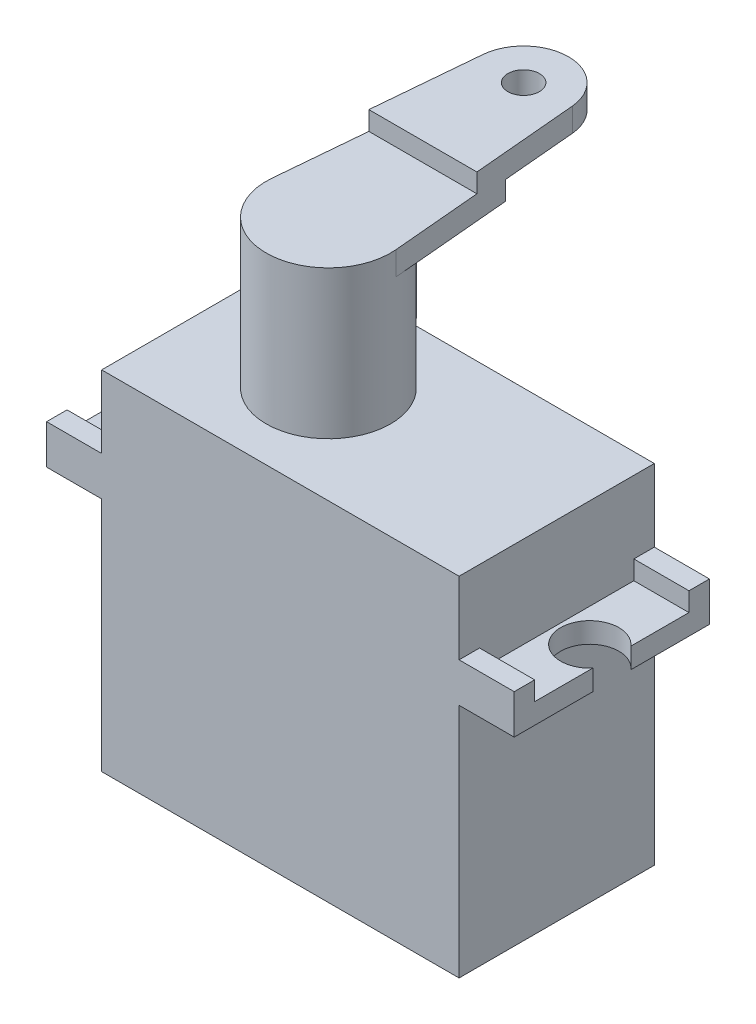
ISO-10303-21;
HEADER;
FILE_DESCRIPTION(('STEP AP214'),'2;1');
FILE_NAME('part.step','',(''),(''),'','','');
FILE_SCHEMA(('AUTOMOTIVE_DESIGN { 1 0 10303 214 1 1 1 1 }'));
ENDSEC;
DATA;
#1=APPLICATION_CONTEXT('core data for automotive mechanical design processes');
#2=APPLICATION_PROTOCOL_DEFINITION('international standard','automotive_design',2000,#1);
#3=PRODUCT_CONTEXT('',#1,'mechanical');
#4=PRODUCT('Part','Part','',(#3));
#5=PRODUCT_RELATED_PRODUCT_CATEGORY('part','',(#4));
#6=PRODUCT_DEFINITION_FORMATION('','',#4);
#7=PRODUCT_DEFINITION_CONTEXT('part definition',#1,'design');
#8=PRODUCT_DEFINITION('design','',#6,#7);
#9=PRODUCT_DEFINITION_SHAPE('','',#8);
#10=(LENGTH_UNIT() NAMED_UNIT(*) SI_UNIT(.MILLI.,.METRE.));
#11=(NAMED_UNIT(*) PLANE_ANGLE_UNIT() SI_UNIT($,.RADIAN.));
#12=(NAMED_UNIT(*) SI_UNIT($,.STERADIAN.) SOLID_ANGLE_UNIT());
#13=UNCERTAINTY_MEASURE_WITH_UNIT(LENGTH_MEASURE(1.E-05),#10,'distance_accuracy_value','');
#14=(GEOMETRIC_REPRESENTATION_CONTEXT(3) GLOBAL_UNCERTAINTY_ASSIGNED_CONTEXT((#13)) GLOBAL_UNIT_ASSIGNED_CONTEXT((#10,
#11,#12)) REPRESENTATION_CONTEXT('',''));
#15=CARTESIAN_POINT('',(0.,0.,0.));
#16=DIRECTION('',(0.,0.,1.));
#17=DIRECTION('',(1.,0.,0.));
#18=AXIS2_PLACEMENT_3D('',#15,#16,#17);
#19=CARTESIAN_POINT('',(-3.15,16.45,-6.2));
#20=DIRECTION('',(0.,1.,0.));
#21=DIRECTION('',(0.,0.,1.));
#22=AXIS2_PLACEMENT_3D('',#19,#20,#21);
#23=PLANE('',#22);
#24=CARTESIAN_POINT('',(-3.15,16.45,-6.2));
#25=DIRECTION('',(0.,1.,0.));
#26=DIRECTION('',(0.,0.,1.));
#27=AXIS2_PLACEMENT_3D('',#24,#25,#26);
#28=CIRCLE('',#27,1.);
#29=CARTESIAN_POINT('',(-3.15,16.45,-5.2));
#30=VERTEX_POINT('',#29);
#31=EDGE_CURVE('E589',#30,#30,#28,.T.);
#32=ORIENTED_EDGE('',*,*,#31,.F.);
#33=EDGE_LOOP('',(#32));
#34=FACE_BOUND('',#33,.T.);
#35=DIRECTION('',(-0.088709677419355,0.,0.99605752501156));
#36=VECTOR('',#35,1.);
#37=CARTESIAN_POINT('',(-5.98876394628295,16.45,-6.45282258064516));
#38=LINE('',#37,#36);
#39=CARTESIAN_POINT('',(-5.98876394628295,16.45,-6.45282258064516));
#40=VERTEX_POINT('',#39);
#41=CARTESIAN_POINT('',(-6.58126963017945,16.45,0.199999999999999));
#42=VERTEX_POINT('',#41);
#43=EDGE_CURVE('E274',#40,#42,#38,.T.);
#44=ORIENTED_EDGE('',*,*,#43,.T.);
#45=DIRECTION('',(1.,0.,0.));
#46=VECTOR('',#45,1.);
#47=CARTESIAN_POINT('',(-14.85,16.45,0.199999999999999));
#48=LINE('',#47,#46);
#49=CARTESIAN_POINT('',(0.281269630179444,16.45,0.199999999999999));
#50=VERTEX_POINT('',#49);
#51=EDGE_CURVE('E254',#42,#50,#48,.T.);
#52=ORIENTED_EDGE('',*,*,#51,.T.);
#53=DIRECTION('',(-0.0887096774193549,0.,-0.99605752501156));
#54=VECTOR('',#53,1.);
#55=CARTESIAN_POINT('',(0.784427223795657,16.45,5.84959677419355));
#56=LINE('',#55,#54);
#57=CARTESIAN_POINT('',(-0.311236053717059,16.45,-6.45282258064516));
#58=VERTEX_POINT('',#57);
#59=EDGE_CURVE('E282',#50,#58,#56,.T.);
#60=ORIENTED_EDGE('',*,*,#59,.T.);
#61=CARTESIAN_POINT('',(-3.15,16.45,-6.2));
#62=DIRECTION('',(0.,1.,0.));
#63=DIRECTION('',(0.,0.,1.));
#64=AXIS2_PLACEMENT_3D('',#61,#62,#63);
#65=CIRCLE('',#64,2.85);
#66=EDGE_CURVE('E281',#58,#40,#65,.T.);
#67=ORIENTED_EDGE('',*,*,#66,.T.);
#68=EDGE_LOOP('',(#44,#52,#60,#67));
#69=FACE_BOUND('',#68,.T.);
#70=ADVANCED_FACE('F44',(#34,#69),#23,.T.);
#71=CARTESIAN_POINT('',(-14.85,1.25,12.4));
#72=DIRECTION('',(1.,0.,0.));
#73=DIRECTION('',(0.,0.,-1.));
#74=AXIS2_PLACEMENT_3D('',#71,#72,#73);
#75=PLANE('',#74);
#76=DIRECTION('',(0.,1.,0.));
#77=VECTOR('',#76,1.);
#78=CARTESIAN_POINT('',(-14.85,-1.75,7.40933866224478));
#79=LINE('',#78,#77);
#80=CARTESIAN_POINT('',(-14.85,-1.25,7.40933866224478));
#81=VERTEX_POINT('',#80);
#82=CARTESIAN_POINT('',(-14.85,0.0500000000000001,7.40933866224478));
#83=VERTEX_POINT('',#82);
#84=EDGE_CURVE('E317',#81,#83,#79,.T.);
#85=ORIENTED_EDGE('',*,*,#84,.F.);
#86=DIRECTION('',(0.,0.,-1.));
#87=VECTOR('',#86,1.);
#88=CARTESIAN_POINT('',(-14.85,-1.25,12.4));
#89=LINE('',#88,#87);
#90=CARTESIAN_POINT('',(-14.85,-1.25,12.4));
#91=VERTEX_POINT('',#90);
#92=EDGE_CURVE('E541',#91,#81,#89,.T.);
#93=ORIENTED_EDGE('',*,*,#92,.F.);
#94=DIRECTION('',(0.,-1.,0.));
#95=VECTOR('',#94,1.);
#96=CARTESIAN_POINT('',(-14.85,1.25,12.4));
#97=LINE('',#96,#95);
#98=CARTESIAN_POINT('',(-14.85,1.25,12.4));
#99=VERTEX_POINT('',#98);
#100=EDGE_CURVE('E431',#99,#91,#97,.T.);
#101=ORIENTED_EDGE('',*,*,#100,.F.);
#102=DIRECTION('',(0.,0.,-1.));
#103=VECTOR('',#102,1.);
#104=CARTESIAN_POINT('',(-14.85,1.25,12.4));
#105=LINE('',#104,#103);
#106=CARTESIAN_POINT('',(-14.85,1.25,11.1));
#107=VERTEX_POINT('',#106);
#108=EDGE_CURVE('E546',#99,#107,#105,.T.);
#109=ORIENTED_EDGE('',*,*,#108,.T.);
#110=DIRECTION('',(0.,1.,0.));
#111=VECTOR('',#110,1.);
#112=CARTESIAN_POINT('',(-14.85,0.0500000000000001,11.1));
#113=LINE('',#112,#111);
#114=CARTESIAN_POINT('',(-14.85,0.0500000000000001,11.1));
#115=VERTEX_POINT('',#114);
#116=EDGE_CURVE('E367',#115,#107,#113,.T.);
#117=ORIENTED_EDGE('',*,*,#116,.F.);
#118=DIRECTION('',(0.,0.,-1.));
#119=VECTOR('',#118,1.);
#120=CARTESIAN_POINT('',(-14.85,0.0500000000000001,0.));
#121=LINE('',#120,#119);
#122=EDGE_CURVE('E340',#115,#83,#121,.T.);
#123=ORIENTED_EDGE('',*,*,#122,.T.);
#124=EDGE_LOOP('',(#85,#93,#101,#109,#117,#123));
#125=FACE_BOUND('',#124,.T.);
#126=ADVANCED_FACE('F608',(#125),#75,.F.);
#127=CARTESIAN_POINT('',(-14.85,1.25,12.4));
#128=DIRECTION('',(0.,-1.,0.));
#129=DIRECTION('',(1.,0.,0.));
#130=AXIS2_PLACEMENT_3D('',#127,#128,#129);
#131=PLANE('',#130);
#132=DIRECTION('',(0.,0.,-1.));
#133=VECTOR('',#132,1.);
#134=CARTESIAN_POINT('',(-11.35,1.25,12.4));
#135=LINE('',#134,#133);
#136=CARTESIAN_POINT('',(-11.35,1.25,12.4));
#137=VERTEX_POINT('',#136);
#138=CARTESIAN_POINT('',(-11.35,1.25,11.1));
#139=VERTEX_POINT('',#138);
#140=EDGE_CURVE('E323',#137,#139,#135,.T.);
#141=ORIENTED_EDGE('',*,*,#140,.T.);
#142=DIRECTION('',(-1.,0.,0.));
#143=VECTOR('',#142,1.);
#144=CARTESIAN_POINT('',(0.,1.25000000000001,11.1));
#145=LINE('',#144,#143);
#146=EDGE_CURVE('E334',#139,#107,#145,.T.);
#147=ORIENTED_EDGE('',*,*,#146,.T.);
#148=ORIENTED_EDGE('',*,*,#108,.F.);
#149=DIRECTION('',(-1.,0.,0.));
#150=VECTOR('',#149,1.);
#151=CARTESIAN_POINT('',(-14.85,1.25,12.4));
#152=LINE('',#151,#150);
#153=EDGE_CURVE('E430',#137,#99,#152,.T.);
#154=ORIENTED_EDGE('',*,*,#153,.F.);
#155=EDGE_LOOP('',(#141,#147,#148,#154));
#156=FACE_BOUND('',#155,.T.);
#157=ADVANCED_FACE('F620',(#156),#131,.F.);
#158=CARTESIAN_POINT('',(14.85,1.25,12.4));
#159=DIRECTION('',(-1.,0.,0.));
#160=DIRECTION('',(0.,0.,1.));
#161=AXIS2_PLACEMENT_3D('',#158,#159,#160);
#162=PLANE('',#161);
#163=DIRECTION('',(0.,1.,0.));
#164=VECTOR('',#163,1.);
#165=CARTESIAN_POINT('',(14.85,-1.75,4.99066133775522));
#166=LINE('',#165,#164);
#167=CARTESIAN_POINT('',(14.85,-1.25,4.99066133775522));
#168=VERTEX_POINT('',#167);
#169=CARTESIAN_POINT('',(14.85,0.0500000000000001,4.99066133775522));
#170=VERTEX_POINT('',#169);
#171=EDGE_CURVE('E361',#168,#170,#166,.T.);
#172=ORIENTED_EDGE('',*,*,#171,.F.);
#173=DIRECTION('',(0.,0.,-1.));
#174=VECTOR('',#173,1.);
#175=CARTESIAN_POINT('',(14.85,-1.25,12.4));
#176=LINE('',#175,#174);
#177=CARTESIAN_POINT('',(14.85,-1.25,0.));
#178=VERTEX_POINT('',#177);
#179=EDGE_CURVE('E518',#168,#178,#176,.T.);
#180=ORIENTED_EDGE('',*,*,#179,.T.);
#181=DIRECTION('',(0.,1.,0.));
#182=VECTOR('',#181,1.);
#183=CARTESIAN_POINT('',(14.85,1.25,0.));
#184=LINE('',#183,#182);
#185=CARTESIAN_POINT('',(14.85,1.25,0.));
#186=VERTEX_POINT('',#185);
#187=EDGE_CURVE('E487',#178,#186,#184,.T.);
#188=ORIENTED_EDGE('',*,*,#187,.T.);
#189=DIRECTION('',(0.,0.,-1.));
#190=VECTOR('',#189,1.);
#191=CARTESIAN_POINT('',(14.85,1.25,12.4));
#192=LINE('',#191,#190);
#193=CARTESIAN_POINT('',(14.85,1.25,1.3));
#194=VERTEX_POINT('',#193);
#195=EDGE_CURVE('E514',#194,#186,#192,.T.);
#196=ORIENTED_EDGE('',*,*,#195,.F.);
#197=DIRECTION('',(0.,1.,0.));
#198=VECTOR('',#197,1.);
#199=CARTESIAN_POINT('',(14.85,0.0500000000000001,1.3));
#200=LINE('',#199,#198);
#201=CARTESIAN_POINT('',(14.85,0.0500000000000001,1.3));
#202=VERTEX_POINT('',#201);
#203=EDGE_CURVE('E419',#202,#194,#200,.T.);
#204=ORIENTED_EDGE('',*,*,#203,.F.);
#205=DIRECTION('',(0.,0.,-1.));
#206=VECTOR('',#205,1.);
#207=CARTESIAN_POINT('',(14.85,0.0500000000000001,0.));
#208=LINE('',#207,#206);
#209=EDGE_CURVE('E390',#170,#202,#208,.T.);
#210=ORIENTED_EDGE('',*,*,#209,.F.);
#211=EDGE_LOOP('',(#172,#180,#188,#196,#204,#210));
#212=FACE_BOUND('',#211,.T.);
#213=ADVANCED_FACE('F700',(#212),#162,.F.);
#214=CARTESIAN_POINT('',(11.35,1.25,12.4));
#215=DIRECTION('',(0.,-1.,0.));
#216=DIRECTION('',(1.,0.,0.));
#217=AXIS2_PLACEMENT_3D('',#214,#215,#216);
#218=PLANE('',#217);
#219=DIRECTION('',(1.,0.,0.));
#220=VECTOR('',#219,1.);
#221=CARTESIAN_POINT('',(0.,1.25000000000001,11.1));
#222=LINE('',#221,#220);
#223=CARTESIAN_POINT('',(11.35,1.25,11.1));
#224=VERTEX_POINT('',#223);
#225=CARTESIAN_POINT('',(14.85,1.25,11.1));
#226=VERTEX_POINT('',#225);
#227=EDGE_CURVE('E389',#224,#226,#222,.T.);
#228=ORIENTED_EDGE('',*,*,#227,.F.);
#229=DIRECTION('',(0.,0.,-1.));
#230=VECTOR('',#229,1.);
#231=CARTESIAN_POINT('',(11.35,1.25,12.4));
#232=LINE('',#231,#230);
#233=CARTESIAN_POINT('',(11.35,1.25,12.4));
#234=VERTEX_POINT('',#233);
#235=EDGE_CURVE('E509',#234,#224,#232,.T.);
#236=ORIENTED_EDGE('',*,*,#235,.F.);
#237=DIRECTION('',(-1.,0.,0.));
#238=VECTOR('',#237,1.);
#239=CARTESIAN_POINT('',(11.35,1.25,12.4));
#240=LINE('',#239,#238);
#241=CARTESIAN_POINT('',(14.85,1.25,12.4));
#242=VERTEX_POINT('',#241);
#243=EDGE_CURVE('E455',#242,#234,#240,.T.);
#244=ORIENTED_EDGE('',*,*,#243,.F.);
#245=EDGE_CURVE('E513',#242,#226,#192,.T.);
#246=ORIENTED_EDGE('',*,*,#245,.T.);
#247=EDGE_LOOP('',(#228,#236,#244,#246));
#248=FACE_BOUND('',#247,.T.);
#249=ADVANCED_FACE('F692',(#248),#218,.F.);
#250=CARTESIAN_POINT('',(-11.35,5.85,12.4));
#251=DIRECTION('',(1.,0.,0.));
#252=DIRECTION('',(0.,1.,0.));
#253=AXIS2_PLACEMENT_3D('',#250,#251,#252);
#254=PLANE('',#253);
#255=DIRECTION('',(0.,-1.,0.));
#256=VECTOR('',#255,1.);
#257=CARTESIAN_POINT('',(-11.35,5.85,0.));
#258=LINE('',#257,#256);
#259=CARTESIAN_POINT('',(-11.35,5.85,0.));
#260=VERTEX_POINT('',#259);
#261=CARTESIAN_POINT('',(-11.35,1.25,0.));
#262=VERTEX_POINT('',#261);
#263=EDGE_CURVE('E411',#260,#262,#258,.T.);
#264=ORIENTED_EDGE('',*,*,#263,.T.);
#265=CARTESIAN_POINT('',(-11.35,1.25,1.3));
#266=VERTEX_POINT('',#265);
#267=EDGE_CURVE('E549',#266,#262,#135,.T.);
#268=ORIENTED_EDGE('',*,*,#267,.F.);
#269=DIRECTION('',(0.,1.,0.));
#270=VECTOR('',#269,1.);
#271=CARTESIAN_POINT('',(-11.35,0.0500000000000021,1.3));
#272=LINE('',#271,#270);
#273=CARTESIAN_POINT('',(-11.35,0.0500000000000021,1.3));
#274=VERTEX_POINT('',#273);
#275=EDGE_CURVE('E365',#274,#266,#272,.T.);
#276=ORIENTED_EDGE('',*,*,#275,.F.);
#277=DIRECTION('',(0.,0.,1.));
#278=VECTOR('',#277,1.);
#279=CARTESIAN_POINT('',(-11.35,0.0500000000000021,0.));
#280=LINE('',#279,#278);
#281=CARTESIAN_POINT('',(-11.35,0.0500000000000021,11.1));
#282=VERTEX_POINT('',#281);
#283=EDGE_CURVE('E350',#274,#282,#280,.T.);
#284=ORIENTED_EDGE('',*,*,#283,.T.);
#285=DIRECTION('',(0.,1.,0.));
#286=VECTOR('',#285,1.);
#287=CARTESIAN_POINT('',(-11.35,0.0500000000000021,11.1));
#288=LINE('',#287,#286);
#289=EDGE_CURVE('E370',#282,#139,#288,.T.);
#290=ORIENTED_EDGE('',*,*,#289,.T.);
#291=ORIENTED_EDGE('',*,*,#140,.F.);
#292=DIRECTION('',(0.,-1.,0.));
#293=VECTOR('',#292,1.);
#294=CARTESIAN_POINT('',(-11.35,5.85,12.4));
#295=LINE('',#294,#293);
#296=CARTESIAN_POINT('',(-11.35,5.85,12.4));
#297=VERTEX_POINT('',#296);
#298=EDGE_CURVE('E421',#297,#137,#295,.T.);
#299=ORIENTED_EDGE('',*,*,#298,.F.);
#300=DIRECTION('',(0.,0.,-1.));
#301=VECTOR('',#300,1.);
#302=CARTESIAN_POINT('',(-11.35,5.85,12.4));
#303=LINE('',#302,#301);
#304=EDGE_CURVE('E464',#297,#260,#303,.T.);
#305=ORIENTED_EDGE('',*,*,#304,.T.);
#306=EDGE_LOOP('',(#264,#268,#276,#284,#290,#291,#299,#305));
#307=FACE_BOUND('',#306,.T.);
#308=ADVANCED_FACE('F50',(#307),#254,.F.);
#309=DIRECTION('',(-1.,0.,0.));
#310=VECTOR('',#309,1.);
#311=CARTESIAN_POINT('',(0.,1.25000000000001,1.3));
#312=LINE('',#311,#310);
#313=CARTESIAN_POINT('',(-14.85,1.25,1.3));
#314=VERTEX_POINT('',#313);
#315=EDGE_CURVE('E338',#266,#314,#312,.T.);
#316=ORIENTED_EDGE('',*,*,#315,.F.);
#317=ORIENTED_EDGE('',*,*,#267,.T.);
#318=DIRECTION('',(-1.,0.,0.));
#319=VECTOR('',#318,1.);
#320=CARTESIAN_POINT('',(-14.85,1.25,0.));
#321=LINE('',#320,#319);
#322=CARTESIAN_POINT('',(-14.85,1.25,0.));
#323=VERTEX_POINT('',#322);
#324=EDGE_CURVE('E462',#262,#323,#321,.T.);
#325=ORIENTED_EDGE('',*,*,#324,.T.);
#326=EDGE_CURVE('E544',#314,#323,#105,.T.);
#327=ORIENTED_EDGE('',*,*,#326,.F.);
#328=EDGE_LOOP('',(#316,#317,#325,#327));
#329=FACE_BOUND('',#328,.T.);
#330=ADVANCED_FACE('F720',(#329),#131,.F.);
#331=CARTESIAN_POINT('',(-14.85,-1.25,4.99066133775522));
#332=VERTEX_POINT('',#331);
#333=CARTESIAN_POINT('',(-14.85,-1.25,0.));
#334=VERTEX_POINT('',#333);
#335=EDGE_CURVE('E539',#332,#334,#89,.T.);
#336=ORIENTED_EDGE('',*,*,#335,.F.);
#337=DIRECTION('',(0.,1.,0.));
#338=VECTOR('',#337,1.);
#339=CARTESIAN_POINT('',(-14.85,-1.75,4.99066133775522));
#340=LINE('',#339,#338);
#341=CARTESIAN_POINT('',(-14.85,0.0500000000000001,4.99066133775522));
#342=VERTEX_POINT('',#341);
#343=EDGE_CURVE('E322',#332,#342,#340,.T.);
#344=ORIENTED_EDGE('',*,*,#343,.T.);
#345=CARTESIAN_POINT('',(-14.85,0.0500000000000001,1.3));
#346=VERTEX_POINT('',#345);
#347=EDGE_CURVE('E342',#342,#346,#121,.T.);
#348=ORIENTED_EDGE('',*,*,#347,.T.);
#349=DIRECTION('',(0.,1.,0.));
#350=VECTOR('',#349,1.);
#351=CARTESIAN_POINT('',(-14.85,0.0500000000000001,1.3));
#352=LINE('',#351,#350);
#353=EDGE_CURVE('E357',#346,#314,#352,.T.);
#354=ORIENTED_EDGE('',*,*,#353,.T.);
#355=ORIENTED_EDGE('',*,*,#326,.T.);
#356=DIRECTION('',(0.,-1.,0.));
#357=VECTOR('',#356,1.);
#358=CARTESIAN_POINT('',(-14.85,1.25,0.));
#359=LINE('',#358,#357);
#360=EDGE_CURVE('E467',#323,#334,#359,.T.);
#361=ORIENTED_EDGE('',*,*,#360,.T.);
#362=EDGE_LOOP('',(#336,#344,#348,#354,#355,#361));
#363=FACE_BOUND('',#362,.T.);
#364=ADVANCED_FACE('F619',(#363),#75,.F.);
#365=CARTESIAN_POINT('',(-14.85,-1.25,12.4));
#366=DIRECTION('',(0.,1.,0.));
#367=DIRECTION('',(-1.,0.,0.));
#368=AXIS2_PLACEMENT_3D('',#365,#366,#367);
#369=PLANE('',#368);
#370=CARTESIAN_POINT('',(-13.45,-1.25,6.2));
#371=DIRECTION('',(0.,1.,0.));
#372=DIRECTION('',(-1.,0.,0.));
#373=AXIS2_PLACEMENT_3D('',#370,#371,#372);
#374=CIRCLE('',#373,1.85);
#375=EDGE_CURVE('E327',#332,#81,#374,.F.);
#376=ORIENTED_EDGE('',*,*,#375,.F.);
#377=ORIENTED_EDGE('',*,*,#335,.T.);
#378=DIRECTION('',(1.,0.,0.));
#379=VECTOR('',#378,1.);
#380=CARTESIAN_POINT('',(-14.85,-1.25,0.));
#381=LINE('',#380,#379);
#382=CARTESIAN_POINT('',(-11.35,-1.25,0.));
#383=VERTEX_POINT('',#382);
#384=EDGE_CURVE('E471',#334,#383,#381,.T.);
#385=ORIENTED_EDGE('',*,*,#384,.T.);
#386=DIRECTION('',(0.,0.,-1.));
#387=VECTOR('',#386,1.);
#388=CARTESIAN_POINT('',(-11.35,-1.25,12.4));
#389=LINE('',#388,#387);
#390=CARTESIAN_POINT('',(-11.35,-1.25,12.4));
#391=VERTEX_POINT('',#390);
#392=EDGE_CURVE('E536',#391,#383,#389,.T.);
#393=ORIENTED_EDGE('',*,*,#392,.F.);
#394=DIRECTION('',(1.,0.,0.));
#395=VECTOR('',#394,1.);
#396=CARTESIAN_POINT('',(-14.85,-1.25,12.4));
#397=LINE('',#396,#395);
#398=EDGE_CURVE('E432',#91,#391,#397,.T.);
#399=ORIENTED_EDGE('',*,*,#398,.F.);
#400=ORIENTED_EDGE('',*,*,#92,.T.);
#401=EDGE_LOOP('',(#376,#377,#385,#393,#399,#400));
#402=FACE_BOUND('',#401,.T.);
#403=ADVANCED_FACE('F715',(#402),#369,.F.);
#404=CARTESIAN_POINT('',(-11.35,-1.25,12.4));
#405=DIRECTION('',(1.,0.,0.));
#406=DIRECTION('',(0.,1.,0.));
#407=AXIS2_PLACEMENT_3D('',#404,#405,#406);
#408=PLANE('',#407);
#409=DIRECTION('',(0.,-1.,0.));
#410=VECTOR('',#409,1.);
#411=CARTESIAN_POINT('',(-11.35,-1.25,0.));
#412=LINE('',#411,#410);
#413=CARTESIAN_POINT('',(-11.35,-16.25,0.));
#414=VERTEX_POINT('',#413);
#415=EDGE_CURVE('E478',#383,#414,#412,.T.);
#416=ORIENTED_EDGE('',*,*,#415,.T.);
#417=DIRECTION('',(0.,0.,-1.));
#418=VECTOR('',#417,1.);
#419=CARTESIAN_POINT('',(-11.35,-16.25,12.4));
#420=LINE('',#419,#418);
#421=CARTESIAN_POINT('',(-11.35,-16.25,12.4));
#422=VERTEX_POINT('',#421);
#423=EDGE_CURVE('E535',#422,#414,#420,.T.);
#424=ORIENTED_EDGE('',*,*,#423,.F.);
#425=DIRECTION('',(0.,-1.,0.));
#426=VECTOR('',#425,1.);
#427=CARTESIAN_POINT('',(-11.35,-1.25,12.4));
#428=LINE('',#427,#426);
#429=EDGE_CURVE('E440',#391,#422,#428,.T.);
#430=ORIENTED_EDGE('',*,*,#429,.F.);
#431=ORIENTED_EDGE('',*,*,#392,.T.);
#432=EDGE_LOOP('',(#416,#424,#430,#431));
#433=FACE_BOUND('',#432,.T.);
#434=ADVANCED_FACE('F708',(#433),#408,.F.);
#435=CARTESIAN_POINT('',(-11.35,-16.25,12.4));
#436=DIRECTION('',(0.,1.,0.));
#437=DIRECTION('',(0.,0.,1.));
#438=AXIS2_PLACEMENT_3D('',#435,#436,#437);
#439=PLANE('',#438);
#440=DIRECTION('',(1.,0.,0.));
#441=VECTOR('',#440,1.);
#442=CARTESIAN_POINT('',(-11.35,-16.25,0.));
#443=LINE('',#442,#441);
#444=CARTESIAN_POINT('',(11.35,-16.25,0.));
#445=VERTEX_POINT('',#444);
#446=EDGE_CURVE('E479',#414,#445,#443,.T.);
#447=ORIENTED_EDGE('',*,*,#446,.T.);
#448=DIRECTION('',(0.,0.,-1.));
#449=VECTOR('',#448,1.);
#450=CARTESIAN_POINT('',(11.35,-16.25,12.4));
#451=LINE('',#450,#449);
#452=CARTESIAN_POINT('',(11.35,-16.25,12.4));
#453=VERTEX_POINT('',#452);
#454=EDGE_CURVE('E526',#453,#445,#451,.T.);
#455=ORIENTED_EDGE('',*,*,#454,.F.);
#456=DIRECTION('',(1.,0.,0.));
#457=VECTOR('',#456,1.);
#458=CARTESIAN_POINT('',(-11.35,-16.25,12.4));
#459=LINE('',#458,#457);
#460=EDGE_CURVE('E439',#422,#453,#459,.T.);
#461=ORIENTED_EDGE('',*,*,#460,.F.);
#462=ORIENTED_EDGE('',*,*,#423,.T.);
#463=EDGE_LOOP('',(#447,#455,#461,#462));
#464=FACE_BOUND('',#463,.T.);
#465=ADVANCED_FACE('F702',(#464),#439,.F.);
#466=CARTESIAN_POINT('',(11.35,-1.25,12.4));
#467=DIRECTION('',(-1.,0.,0.));
#468=DIRECTION('',(0.,-1.,0.));
#469=AXIS2_PLACEMENT_3D('',#466,#467,#468);
#470=PLANE('',#469);
#471=DIRECTION('',(0.,1.,0.));
#472=VECTOR('',#471,1.);
#473=CARTESIAN_POINT('',(11.35,-1.25,0.));
#474=LINE('',#473,#472);
#475=CARTESIAN_POINT('',(11.35,-1.25,0.));
#476=VERTEX_POINT('',#475);
#477=EDGE_CURVE('E485',#445,#476,#474,.T.);
#478=ORIENTED_EDGE('',*,*,#477,.T.);
#479=DIRECTION('',(0.,0.,-1.));
#480=VECTOR('',#479,1.);
#481=CARTESIAN_POINT('',(11.35,-1.25,12.4));
#482=LINE('',#481,#480);
#483=CARTESIAN_POINT('',(11.35,-1.25,12.4));
#484=VERTEX_POINT('',#483);
#485=EDGE_CURVE('E522',#484,#476,#482,.T.);
#486=ORIENTED_EDGE('',*,*,#485,.F.);
#487=DIRECTION('',(0.,1.,0.));
#488=VECTOR('',#487,1.);
#489=CARTESIAN_POINT('',(11.35,-1.25,12.4));
#490=LINE('',#489,#488);
#491=EDGE_CURVE('E444',#453,#484,#490,.T.);
#492=ORIENTED_EDGE('',*,*,#491,.F.);
#493=ORIENTED_EDGE('',*,*,#454,.T.);
#494=EDGE_LOOP('',(#478,#486,#492,#493));
#495=FACE_BOUND('',#494,.T.);
#496=ADVANCED_FACE('F697',(#495),#470,.F.);
#497=CARTESIAN_POINT('',(11.35,-1.25,12.4));
#498=DIRECTION('',(0.,1.,0.));
#499=DIRECTION('',(-1.,0.,0.));
#500=AXIS2_PLACEMENT_3D('',#497,#498,#499);
#501=PLANE('',#500);
#502=ORIENTED_EDGE('',*,*,#179,.F.);
#503=CARTESIAN_POINT('',(13.45,-1.25,6.2));
#504=DIRECTION('',(0.,1.,0.));
#505=DIRECTION('',(-1.,0.,0.));
#506=AXIS2_PLACEMENT_3D('',#503,#504,#505);
#507=CIRCLE('',#506,1.85);
#508=CARTESIAN_POINT('',(14.85,-1.25,7.40933866224478));
#509=VERTEX_POINT('',#508);
#510=EDGE_CURVE('E380',#168,#509,#507,.T.);
#511=ORIENTED_EDGE('',*,*,#510,.T.);
#512=CARTESIAN_POINT('',(14.85,-1.25,12.4));
#513=VERTEX_POINT('',#512);
#514=EDGE_CURVE('E517',#513,#509,#176,.T.);
#515=ORIENTED_EDGE('',*,*,#514,.F.);
#516=DIRECTION('',(1.,0.,0.));
#517=VECTOR('',#516,1.);
#518=CARTESIAN_POINT('',(11.35,-1.25,12.4));
#519=LINE('',#518,#517);
#520=EDGE_CURVE('E449',#484,#513,#519,.T.);
#521=ORIENTED_EDGE('',*,*,#520,.F.);
#522=ORIENTED_EDGE('',*,*,#485,.T.);
#523=DIRECTION('',(1.,0.,0.));
#524=VECTOR('',#523,1.);
#525=CARTESIAN_POINT('',(11.35,-1.25,0.));
#526=LINE('',#525,#524);
#527=EDGE_CURVE('E484',#476,#178,#526,.T.);
#528=ORIENTED_EDGE('',*,*,#527,.T.);
#529=EDGE_LOOP('',(#502,#511,#515,#521,#522,#528));
#530=FACE_BOUND('',#529,.T.);
#531=ADVANCED_FACE('F694',(#530),#501,.F.);
#532=ORIENTED_EDGE('',*,*,#514,.T.);
#533=DIRECTION('',(0.,1.,0.));
#534=VECTOR('',#533,1.);
#535=CARTESIAN_POINT('',(14.85,-1.75,7.40933866224478));
#536=LINE('',#535,#534);
#537=CARTESIAN_POINT('',(14.85,0.0500000000000001,7.40933866224478));
#538=VERTEX_POINT('',#537);
#539=EDGE_CURVE('E373',#509,#538,#536,.T.);
#540=ORIENTED_EDGE('',*,*,#539,.T.);
#541=CARTESIAN_POINT('',(14.85,0.0500000000000001,11.1));
#542=VERTEX_POINT('',#541);
#543=EDGE_CURVE('E395',#542,#538,#208,.T.);
#544=ORIENTED_EDGE('',*,*,#543,.F.);
#545=DIRECTION('',(0.,1.,0.));
#546=VECTOR('',#545,1.);
#547=CARTESIAN_POINT('',(14.85,0.0500000000000001,11.1));
#548=LINE('',#547,#546);
#549=EDGE_CURVE('E408',#542,#226,#548,.T.);
#550=ORIENTED_EDGE('',*,*,#549,.T.);
#551=ORIENTED_EDGE('',*,*,#245,.F.);
#552=DIRECTION('',(0.,1.,0.));
#553=VECTOR('',#552,1.);
#554=CARTESIAN_POINT('',(14.85,1.25,12.4));
#555=LINE('',#554,#553);
#556=EDGE_CURVE('E448',#513,#242,#555,.T.);
#557=ORIENTED_EDGE('',*,*,#556,.F.);
#558=EDGE_LOOP('',(#532,#540,#544,#550,#551,#557));
#559=FACE_BOUND('',#558,.T.);
#560=ADVANCED_FACE('F689',(#559),#162,.F.);
#561=CARTESIAN_POINT('',(11.35,1.25,1.3));
#562=VERTEX_POINT('',#561);
#563=CARTESIAN_POINT('',(11.35,1.25,0.));
#564=VERTEX_POINT('',#563);
#565=EDGE_CURVE('E507',#562,#564,#232,.T.);
#566=ORIENTED_EDGE('',*,*,#565,.F.);
#567=DIRECTION('',(1.,0.,0.));
#568=VECTOR('',#567,1.);
#569=CARTESIAN_POINT('',(0.,1.25000000000001,1.3));
#570=LINE('',#569,#568);
#571=EDGE_CURVE('E382',#562,#194,#570,.T.);
#572=ORIENTED_EDGE('',*,*,#571,.T.);
#573=ORIENTED_EDGE('',*,*,#195,.T.);
#574=DIRECTION('',(-1.,0.,0.));
#575=VECTOR('',#574,1.);
#576=CARTESIAN_POINT('',(11.35,1.25,0.));
#577=LINE('',#576,#575);
#578=EDGE_CURVE('E492',#186,#564,#577,.T.);
#579=ORIENTED_EDGE('',*,*,#578,.T.);
#580=EDGE_LOOP('',(#566,#572,#573,#579));
#581=FACE_BOUND('',#580,.T.);
#582=ADVANCED_FACE('F688',(#581),#218,.F.);
#583=CARTESIAN_POINT('',(11.35,5.85,12.4));
#584=DIRECTION('',(-1.,0.,0.));
#585=DIRECTION('',(0.,-1.,0.));
#586=AXIS2_PLACEMENT_3D('',#583,#584,#585);
#587=PLANE('',#586);
#588=DIRECTION('',(0.,1.,0.));
#589=VECTOR('',#588,1.);
#590=CARTESIAN_POINT('',(11.35,5.85,0.));
#591=LINE('',#590,#589);
#592=CARTESIAN_POINT('',(11.35,5.85,0.));
#593=VERTEX_POINT('',#592);
#594=EDGE_CURVE('E500',#564,#593,#591,.T.);
#595=ORIENTED_EDGE('',*,*,#594,.T.);
#596=DIRECTION('',(0.,0.,-1.));
#597=VECTOR('',#596,1.);
#598=CARTESIAN_POINT('',(11.35,5.85,12.4));
#599=LINE('',#598,#597);
#600=CARTESIAN_POINT('',(11.35,5.85,12.4));
#601=VERTEX_POINT('',#600);
#602=EDGE_CURVE('E502',#601,#593,#599,.T.);
#603=ORIENTED_EDGE('',*,*,#602,.F.);
#604=DIRECTION('',(0.,1.,0.));
#605=VECTOR('',#604,1.);
#606=CARTESIAN_POINT('',(11.35,5.85,12.4));
#607=LINE('',#606,#605);
#608=EDGE_CURVE('E454',#234,#601,#607,.T.);
#609=ORIENTED_EDGE('',*,*,#608,.F.);
#610=ORIENTED_EDGE('',*,*,#235,.T.);
#611=DIRECTION('',(0.,1.,0.));
#612=VECTOR('',#611,1.);
#613=CARTESIAN_POINT('',(11.35,0.0500000000000021,11.1));
#614=LINE('',#613,#612);
#615=CARTESIAN_POINT('',(11.35,0.0500000000000021,11.1));
#616=VERTEX_POINT('',#615);
#617=EDGE_CURVE('E412',#616,#224,#614,.T.);
#618=ORIENTED_EDGE('',*,*,#617,.F.);
#619=DIRECTION('',(0.,0.,1.));
#620=VECTOR('',#619,1.);
#621=CARTESIAN_POINT('',(11.35,0.0500000000000021,0.));
#622=LINE('',#621,#620);
#623=CARTESIAN_POINT('',(11.35,0.0500000000000021,1.3));
#624=VERTEX_POINT('',#623);
#625=EDGE_CURVE('E398',#624,#616,#622,.T.);
#626=ORIENTED_EDGE('',*,*,#625,.F.);
#627=DIRECTION('',(0.,1.,0.));
#628=VECTOR('',#627,1.);
#629=CARTESIAN_POINT('',(11.35,0.0500000000000021,1.3));
#630=LINE('',#629,#628);
#631=EDGE_CURVE('E417',#624,#562,#630,.T.);
#632=ORIENTED_EDGE('',*,*,#631,.T.);
#633=ORIENTED_EDGE('',*,*,#565,.T.);
#634=EDGE_LOOP('',(#595,#603,#609,#610,#618,#626,#632,#633));
#635=FACE_BOUND('',#634,.T.);
#636=ADVANCED_FACE('F681',(#635),#587,.F.);
#637=CARTESIAN_POINT('',(-11.35,5.85,12.4));
#638=DIRECTION('',(0.,-1.,0.));
#639=DIRECTION('',(0.,0.,-1.));
#640=AXIS2_PLACEMENT_3D('',#637,#638,#639);
#641=PLANE('',#640);
#642=CARTESIAN_POINT('',(-3.15,5.85,6.2));
#643=DIRECTION('',(0.,1.,0.));
#644=DIRECTION('',(0.,0.,1.));
#645=AXIS2_PLACEMENT_3D('',#642,#643,#644);
#646=CIRCLE('',#645,3.95);
#647=CARTESIAN_POINT('',(-3.15,5.85,10.15));
#648=VERTEX_POINT('',#647);
#649=EDGE_CURVE('E268',#648,#648,#646,.T.);
#650=ORIENTED_EDGE('',*,*,#649,.F.);
#651=EDGE_LOOP('',(#650));
#652=FACE_BOUND('',#651,.T.);
#653=DIRECTION('',(-1.,0.,0.));
#654=VECTOR('',#653,1.);
#655=CARTESIAN_POINT('',(-11.35,5.85,0.));
#656=LINE('',#655,#654);
#657=EDGE_CURVE('E428',#593,#260,#656,.T.);
#658=ORIENTED_EDGE('',*,*,#657,.T.);
#659=ORIENTED_EDGE('',*,*,#304,.F.);
#660=DIRECTION('',(-1.,0.,0.));
#661=VECTOR('',#660,1.);
#662=CARTESIAN_POINT('',(-11.35,5.85,12.4));
#663=LINE('',#662,#661);
#664=EDGE_CURVE('E456',#601,#297,#663,.T.);
#665=ORIENTED_EDGE('',*,*,#664,.F.);
#666=ORIENTED_EDGE('',*,*,#602,.T.);
#667=EDGE_LOOP('',(#658,#659,#665,#666));
#668=FACE_BOUND('',#667,.T.);
#669=ADVANCED_FACE('F674',(#652,#668),#641,.F.);
#670=CARTESIAN_POINT('',(0.,0.,12.4));
#671=DIRECTION('',(0.,0.,1.));
#672=DIRECTION('',(1.,0.,0.));
#673=AXIS2_PLACEMENT_3D('',#670,#671,#672);
#674=PLANE('',#673);
#675=ORIENTED_EDGE('',*,*,#298,.T.);
#676=ORIENTED_EDGE('',*,*,#153,.T.);
#677=ORIENTED_EDGE('',*,*,#100,.T.);
#678=ORIENTED_EDGE('',*,*,#398,.T.);
#679=ORIENTED_EDGE('',*,*,#429,.T.);
#680=ORIENTED_EDGE('',*,*,#460,.T.);
#681=ORIENTED_EDGE('',*,*,#491,.T.);
#682=ORIENTED_EDGE('',*,*,#520,.T.);
#683=ORIENTED_EDGE('',*,*,#556,.T.);
#684=ORIENTED_EDGE('',*,*,#243,.T.);
#685=ORIENTED_EDGE('',*,*,#608,.T.);
#686=ORIENTED_EDGE('',*,*,#664,.T.);
#687=EDGE_LOOP('',(#675,#676,#677,#678,#679,#680,#681,#682,#683,#684,#685,#686));
#688=FACE_BOUND('',#687,.T.);
#689=ADVANCED_FACE('F675',(#688),#674,.T.);
#690=CARTESIAN_POINT('',(0.,0.,0.));
#691=DIRECTION('',(0.,0.,1.));
#692=DIRECTION('',(1.,0.,0.));
#693=AXIS2_PLACEMENT_3D('',#690,#691,#692);
#694=PLANE('',#693);
#695=ORIENTED_EDGE('',*,*,#263,.F.);
#696=ORIENTED_EDGE('',*,*,#657,.F.);
#697=ORIENTED_EDGE('',*,*,#594,.F.);
#698=ORIENTED_EDGE('',*,*,#578,.F.);
#699=ORIENTED_EDGE('',*,*,#187,.F.);
#700=ORIENTED_EDGE('',*,*,#527,.F.);
#701=ORIENTED_EDGE('',*,*,#477,.F.);
#702=ORIENTED_EDGE('',*,*,#446,.F.);
#703=ORIENTED_EDGE('',*,*,#415,.F.);
#704=ORIENTED_EDGE('',*,*,#384,.F.);
#705=ORIENTED_EDGE('',*,*,#360,.F.);
#706=ORIENTED_EDGE('',*,*,#324,.F.);
#707=EDGE_LOOP('',(#695,#696,#697,#698,#699,#700,#701,#702,#703,#704,#705,#706));
#708=FACE_BOUND('',#707,.T.);
#709=ADVANCED_FACE('F666',(#708),#694,.F.);
#710=CARTESIAN_POINT('',(0.,0.0500000000000084,11.1));
#711=DIRECTION('',(0.,0.,1.));
#712=DIRECTION('',(1.,0.,0.));
#713=AXIS2_PLACEMENT_3D('',#710,#711,#712);
#714=PLANE('',#713);
#715=ORIENTED_EDGE('',*,*,#227,.T.);
#716=ORIENTED_EDGE('',*,*,#549,.F.);
#717=DIRECTION('',(1.,0.,0.));
#718=VECTOR('',#717,1.);
#719=CARTESIAN_POINT('',(0.,0.0500000000000084,11.1));
#720=LINE('',#719,#718);
#721=EDGE_CURVE('E399',#616,#542,#720,.T.);
#722=ORIENTED_EDGE('',*,*,#721,.F.);
#723=ORIENTED_EDGE('',*,*,#617,.T.);
#724=EDGE_LOOP('',(#715,#716,#722,#723));
#725=FACE_BOUND('',#724,.T.);
#726=ADVANCED_FACE('F661',(#725),#714,.F.);
#727=CARTESIAN_POINT('',(0.,0.0500000000000084,1.3));
#728=DIRECTION('',(0.,0.,1.));
#729=DIRECTION('',(1.,0.,0.));
#730=AXIS2_PLACEMENT_3D('',#727,#728,#729);
#731=PLANE('',#730);
#732=ORIENTED_EDGE('',*,*,#571,.F.);
#733=ORIENTED_EDGE('',*,*,#631,.F.);
#734=DIRECTION('',(1.,0.,0.));
#735=VECTOR('',#734,1.);
#736=CARTESIAN_POINT('',(0.,0.0500000000000084,1.3));
#737=LINE('',#736,#735);
#738=EDGE_CURVE('E391',#624,#202,#737,.T.);
#739=ORIENTED_EDGE('',*,*,#738,.T.);
#740=ORIENTED_EDGE('',*,*,#203,.T.);
#741=EDGE_LOOP('',(#732,#733,#739,#740));
#742=FACE_BOUND('',#741,.T.);
#743=ADVANCED_FACE('F665',(#742),#731,.T.);
#744=CARTESIAN_POINT('',(0.,0.0500000000000084,0.));
#745=DIRECTION('',(0.,1.,0.));
#746=DIRECTION('',(-1.,0.,0.));
#747=AXIS2_PLACEMENT_3D('',#744,#745,#746);
#748=PLANE('',#747);
#749=CARTESIAN_POINT('',(13.45,0.050000000000001,6.2));
#750=DIRECTION('',(0.,1.,0.));
#751=DIRECTION('',(-1.,0.,0.));
#752=AXIS2_PLACEMENT_3D('',#749,#750,#751);
#753=CIRCLE('',#752,1.85);
#754=EDGE_CURVE('E383',#170,#538,#753,.T.);
#755=ORIENTED_EDGE('',*,*,#754,.F.);
#756=ORIENTED_EDGE('',*,*,#209,.T.);
#757=ORIENTED_EDGE('',*,*,#738,.F.);
#758=ORIENTED_EDGE('',*,*,#625,.T.);
#759=ORIENTED_EDGE('',*,*,#721,.T.);
#760=ORIENTED_EDGE('',*,*,#543,.T.);
#761=EDGE_LOOP('',(#755,#756,#757,#758,#759,#760));
#762=FACE_BOUND('',#761,.T.);
#763=ADVANCED_FACE('F657',(#762),#748,.T.);
#764=CARTESIAN_POINT('',(13.45,-1.75,6.2));
#765=DIRECTION('',(0.,1.,0.));
#766=DIRECTION('',(-1.,0.,0.));
#767=AXIS2_PLACEMENT_3D('',#764,#765,#766);
#768=CYLINDRICAL_SURFACE('',#767,1.85);
#769=ORIENTED_EDGE('',*,*,#754,.T.);
#770=ORIENTED_EDGE('',*,*,#539,.F.);
#771=ORIENTED_EDGE('',*,*,#510,.F.);
#772=ORIENTED_EDGE('',*,*,#171,.T.);
#773=EDGE_LOOP('',(#769,#770,#771,#772));
#774=FACE_BOUND('',#773,.T.);
#775=ADVANCED_FACE('F651',(#774),#768,.F.);
#776=CARTESIAN_POINT('',(0.,0.0500000000000084,1.3));
#777=DIRECTION('',(0.,0.,-1.));
#778=DIRECTION('',(-1.,0.,0.));
#779=AXIS2_PLACEMENT_3D('',#776,#777,#778);
#780=PLANE('',#779);
#781=ORIENTED_EDGE('',*,*,#315,.T.);
#782=ORIENTED_EDGE('',*,*,#353,.F.);
#783=DIRECTION('',(-1.,0.,0.));
#784=VECTOR('',#783,1.);
#785=CARTESIAN_POINT('',(0.,0.0500000000000084,1.3));
#786=LINE('',#785,#784);
#787=EDGE_CURVE('E348',#274,#346,#786,.T.);
#788=ORIENTED_EDGE('',*,*,#787,.F.);
#789=ORIENTED_EDGE('',*,*,#275,.T.);
#790=EDGE_LOOP('',(#781,#782,#788,#789));
#791=FACE_BOUND('',#790,.T.);
#792=ADVANCED_FACE('F648',(#791),#780,.F.);
#793=CARTESIAN_POINT('',(0.,0.0500000000000084,11.1));
#794=DIRECTION('',(0.,0.,-1.));
#795=DIRECTION('',(-1.,0.,0.));
#796=AXIS2_PLACEMENT_3D('',#793,#794,#795);
#797=PLANE('',#796);
#798=ORIENTED_EDGE('',*,*,#146,.F.);
#799=ORIENTED_EDGE('',*,*,#289,.F.);
#800=DIRECTION('',(-1.,0.,0.));
#801=VECTOR('',#800,1.);
#802=CARTESIAN_POINT('',(0.,0.0500000000000084,11.1));
#803=LINE('',#802,#801);
#804=EDGE_CURVE('E341',#282,#115,#803,.T.);
#805=ORIENTED_EDGE('',*,*,#804,.T.);
#806=ORIENTED_EDGE('',*,*,#116,.T.);
#807=EDGE_LOOP('',(#798,#799,#805,#806));
#808=FACE_BOUND('',#807,.T.);
#809=ADVANCED_FACE('F646',(#808),#797,.T.);
#810=CARTESIAN_POINT('',(0.,0.0500000000000084,0.));
#811=DIRECTION('',(0.,1.,0.));
#812=DIRECTION('',(1.,0.,0.));
#813=AXIS2_PLACEMENT_3D('',#810,#811,#812);
#814=PLANE('',#813);
#815=CARTESIAN_POINT('',(-13.45,0.050000000000001,6.2));
#816=DIRECTION('',(0.,-1.,0.));
#817=DIRECTION('',(1.,0.,0.));
#818=AXIS2_PLACEMENT_3D('',#815,#816,#817);
#819=CIRCLE('',#818,1.85);
#820=EDGE_CURVE('E331',#342,#83,#819,.T.);
#821=ORIENTED_EDGE('',*,*,#820,.T.);
#822=ORIENTED_EDGE('',*,*,#122,.F.);
#823=ORIENTED_EDGE('',*,*,#804,.F.);
#824=ORIENTED_EDGE('',*,*,#283,.F.);
#825=ORIENTED_EDGE('',*,*,#787,.T.);
#826=ORIENTED_EDGE('',*,*,#347,.F.);
#827=EDGE_LOOP('',(#821,#822,#823,#824,#825,#826));
#828=FACE_BOUND('',#827,.T.);
#829=ADVANCED_FACE('F645',(#828),#814,.T.);
#830=CARTESIAN_POINT('',(-13.45,-1.75,6.2));
#831=DIRECTION('',(0.,1.,0.));
#832=DIRECTION('',(-1.,0.,0.));
#833=AXIS2_PLACEMENT_3D('',#830,#831,#832);
#834=CYLINDRICAL_SURFACE('',#833,1.85);
#835=ORIENTED_EDGE('',*,*,#343,.F.);
#836=ORIENTED_EDGE('',*,*,#375,.T.);
#837=ORIENTED_EDGE('',*,*,#84,.T.);
#838=ORIENTED_EDGE('',*,*,#820,.F.);
#839=EDGE_LOOP('',(#835,#836,#837,#838));
#840=FACE_BOUND('',#839,.T.);
#841=ADVANCED_FACE('F636',(#840),#834,.F.);
#842=CARTESIAN_POINT('',(-3.15,13.75,6.2));
#843=DIRECTION('',(0.,-1.,0.));
#844=DIRECTION('',(0.,0.,-1.));
#845=AXIS2_PLACEMENT_3D('',#842,#843,#844);
#846=CYLINDRICAL_SURFACE('',#845,3.95);
#847=DIRECTION('',(0.,-1.,0.));
#848=VECTOR('',#847,1.);
#849=CARTESIAN_POINT('',(0.784427223795658,16.45,5.84959677419355));
#850=LINE('',#849,#848);
#851=CARTESIAN_POINT('',(0.784427223795658,15.25,5.84959677419355));
#852=VERTEX_POINT('',#851);
#853=CARTESIAN_POINT('',(0.784427223795658,13.75,5.84959677419355));
#854=VERTEX_POINT('',#853);
#855=EDGE_CURVE('E308',#852,#854,#850,.T.);
#856=ORIENTED_EDGE('',*,*,#855,.F.);
#857=CARTESIAN_POINT('',(-3.15,15.25,6.2));
#858=DIRECTION('',(0.,-1.,0.));
#859=DIRECTION('',(0.,0.,-1.));
#860=AXIS2_PLACEMENT_3D('',#857,#858,#859);
#861=CIRCLE('',#860,3.95);
#862=CARTESIAN_POINT('',(-7.08442722379567,15.25,5.84959677419355));
#863=VERTEX_POINT('',#862);
#864=EDGE_CURVE('E61',#852,#863,#861,.T.);
#865=ORIENTED_EDGE('',*,*,#864,.T.);
#866=DIRECTION('',(0.,-1.,0.));
#867=VECTOR('',#866,1.);
#868=CARTESIAN_POINT('',(-7.08442722379567,16.45,5.84959677419355));
#869=LINE('',#868,#867);
#870=CARTESIAN_POINT('',(-7.08442722379567,13.75,5.84959677419355));
#871=VERTEX_POINT('',#870);
#872=EDGE_CURVE('E310',#863,#871,#869,.T.);
#873=ORIENTED_EDGE('',*,*,#872,.T.);
#874=CARTESIAN_POINT('',(-3.15,13.75,6.2));
#875=DIRECTION('',(0.,1.,0.));
#876=DIRECTION('',(0.,0.,1.));
#877=AXIS2_PLACEMENT_3D('',#874,#875,#876);
#878=CIRCLE('',#877,3.95);
#879=EDGE_CURVE('E312',#854,#871,#878,.T.);
#880=ORIENTED_EDGE('',*,*,#879,.F.);
#881=EDGE_LOOP('',(#856,#865,#873,#880));
#882=FACE_BOUND('',#881,.T.);
#883=ORIENTED_EDGE('',*,*,#649,.T.);
#884=EDGE_LOOP('',(#883));
#885=FACE_BOUND('',#884,.T.);
#886=ADVANCED_FACE('F626',(#882,#885),#846,.T.);
#887=CARTESIAN_POINT('',(-3.15,13.75,-6.2));
#888=DIRECTION('',(0.,1.,0.));
#889=DIRECTION('',(0.,0.,1.));
#890=AXIS2_PLACEMENT_3D('',#887,#888,#889);
#891=PLANE('',#890);
#892=DIRECTION('',(-0.088709677419355,0.,0.99605752501156));
#893=VECTOR('',#892,1.);
#894=CARTESIAN_POINT('',(-5.98876394628295,13.75,-6.45282258064516));
#895=LINE('',#894,#893);
#896=CARTESIAN_POINT('',(-6.40314803540846,13.75,-1.8));
#897=VERTEX_POINT('',#896);
#898=EDGE_CURVE('E293',#897,#871,#895,.T.);
#899=ORIENTED_EDGE('',*,*,#898,.F.);
#900=DIRECTION('',(1.,0.,0.));
#901=VECTOR('',#900,1.);
#902=CARTESIAN_POINT('',(-14.85,13.75,-1.8));
#903=LINE('',#902,#901);
#904=CARTESIAN_POINT('',(0.103148035408448,13.75,-1.8));
#905=VERTEX_POINT('',#904);
#906=EDGE_CURVE('E576',#897,#905,#903,.T.);
#907=ORIENTED_EDGE('',*,*,#906,.T.);
#908=DIRECTION('',(-0.0887096774193549,0.,-0.99605752501156));
#909=VECTOR('',#908,1.);
#910=CARTESIAN_POINT('',(0.784427223795657,13.75,5.84959677419355));
#911=LINE('',#910,#909);
#912=EDGE_CURVE('E292',#854,#905,#911,.T.);
#913=ORIENTED_EDGE('',*,*,#912,.F.);
#914=ORIENTED_EDGE('',*,*,#879,.T.);
#915=EDGE_LOOP('',(#899,#907,#913,#914));
#916=FACE_BOUND('',#915,.T.);
#917=ADVANCED_FACE('F624',(#916),#891,.F.);
#918=CARTESIAN_POINT('',(-3.15,16.45,-6.2));
#919=DIRECTION('',(0.,-1.,0.));
#920=DIRECTION('',(0.,0.,-1.));
#921=AXIS2_PLACEMENT_3D('',#918,#919,#920);
#922=CYLINDRICAL_SURFACE('',#921,2.85);
#923=DIRECTION('',(0.,-1.,0.));
#924=VECTOR('',#923,1.);
#925=CARTESIAN_POINT('',(-0.311236053717059,16.45,-6.45282258064516));
#926=LINE('',#925,#924);
#927=CARTESIAN_POINT('',(-0.311236053717059,14.95,-6.45282258064516));
#928=VERTEX_POINT('',#927);
#929=EDGE_CURVE('E287',#58,#928,#926,.T.);
#930=ORIENTED_EDGE('',*,*,#929,.T.);
#931=CARTESIAN_POINT('',(-3.15,14.95,-6.2));
#932=DIRECTION('',(0.,1.,0.));
#933=DIRECTION('',(0.,0.,1.));
#934=AXIS2_PLACEMENT_3D('',#931,#932,#933);
#935=CIRCLE('',#934,2.85);
#936=CARTESIAN_POINT('',(-5.98876394628295,14.95,-6.45282258064516));
#937=VERTEX_POINT('',#936);
#938=EDGE_CURVE('E69',#928,#937,#935,.T.);
#939=ORIENTED_EDGE('',*,*,#938,.T.);
#940=DIRECTION('',(0.,-1.,0.));
#941=VECTOR('',#940,1.);
#942=CARTESIAN_POINT('',(-5.98876394628295,16.45,-6.45282258064516));
#943=LINE('',#942,#941);
#944=EDGE_CURVE('E315',#40,#937,#943,.T.);
#945=ORIENTED_EDGE('',*,*,#944,.F.);
#946=ORIENTED_EDGE('',*,*,#66,.F.);
#947=EDGE_LOOP('',(#930,#939,#945,#946));
#948=FACE_BOUND('',#947,.T.);
#949=ADVANCED_FACE('F561',(#948),#922,.T.);
#950=CARTESIAN_POINT('',(-5.98876394628295,16.45,-6.45282258064516));
#951=DIRECTION('',(0.99605752501156,0.,0.0887096774193549));
#952=DIRECTION('',(0.088709677419355,0.,-0.99605752501156));
#953=AXIS2_PLACEMENT_3D('',#950,#951,#952);
#954=PLANE('',#953);
#955=DIRECTION('',(-0.088709677419355,0.,0.99605752501156));
#956=VECTOR('',#955,1.);
#957=CARTESIAN_POINT('',(-5.98876394628295,14.95,-6.45282258064516));
#958=LINE('',#957,#956);
#959=CARTESIAN_POINT('',(-6.40314803540846,14.95,-1.8));
#960=VERTEX_POINT('',#959);
#961=EDGE_CURVE('E564',#937,#960,#958,.T.);
#962=ORIENTED_EDGE('',*,*,#961,.T.);
#963=DIRECTION('',(0.,-1.,0.));
#964=VECTOR('',#963,1.);
#965=CARTESIAN_POINT('',(-6.40314803540846,16.45,-1.8));
#966=LINE('',#965,#964);
#967=EDGE_CURVE('E298',#960,#897,#966,.T.);
#968=ORIENTED_EDGE('',*,*,#967,.T.);
#969=ORIENTED_EDGE('',*,*,#898,.T.);
#970=ORIENTED_EDGE('',*,*,#872,.F.);
#971=DIRECTION('',(0.088709677419355,0.,-0.99605752501156));
#972=VECTOR('',#971,1.);
#973=CARTESIAN_POINT('',(-5.98876394628295,15.25,-6.45282258064516));
#974=LINE('',#973,#972);
#975=CARTESIAN_POINT('',(-6.58126963017945,15.25,0.2));
#976=VERTEX_POINT('',#975);
#977=EDGE_CURVE('E279',#863,#976,#974,.T.);
#978=ORIENTED_EDGE('',*,*,#977,.T.);
#979=DIRECTION('',(0.,1.,0.));
#980=VECTOR('',#979,1.);
#981=CARTESIAN_POINT('',(-6.58126963017945,16.45,0.199999999999999));
#982=LINE('',#981,#980);
#983=EDGE_CURVE('E259',#976,#42,#982,.T.);
#984=ORIENTED_EDGE('',*,*,#983,.T.);
#985=ORIENTED_EDGE('',*,*,#43,.F.);
#986=ORIENTED_EDGE('',*,*,#944,.T.);
#987=EDGE_LOOP('',(#962,#968,#969,#970,#978,#984,#985,#986));
#988=FACE_BOUND('',#987,.T.);
#989=ADVANCED_FACE('F272',(#988),#954,.F.);
#990=CARTESIAN_POINT('',(0.784427223795657,16.45,5.84959677419355));
#991=DIRECTION('',(-0.99605752501156,0.,0.0887096774193549));
#992=DIRECTION('',(0.0887096774193549,0.,0.99605752501156));
#993=AXIS2_PLACEMENT_3D('',#990,#991,#992);
#994=PLANE('',#993);
#995=ORIENTED_EDGE('',*,*,#912,.T.);
#996=DIRECTION('',(0.,1.,0.));
#997=VECTOR('',#996,1.);
#998=CARTESIAN_POINT('',(0.103148035408448,16.45,-1.8));
#999=LINE('',#998,#997);
#1000=CARTESIAN_POINT('',(0.103148035408445,14.95,-1.8));
#1001=VERTEX_POINT('',#1000);
#1002=EDGE_CURVE('E11',#905,#1001,#999,.T.);
#1003=ORIENTED_EDGE('',*,*,#1002,.T.);
#1004=DIRECTION('',(-0.0887096774193549,0.,-0.99605752501156));
#1005=VECTOR('',#1004,1.);
#1006=CARTESIAN_POINT('',(0.784427223795657,14.95,5.84959677419355));
#1007=LINE('',#1006,#1005);
#1008=EDGE_CURVE('E54',#1001,#928,#1007,.T.);
#1009=ORIENTED_EDGE('',*,*,#1008,.T.);
#1010=ORIENTED_EDGE('',*,*,#929,.F.);
#1011=ORIENTED_EDGE('',*,*,#59,.F.);
#1012=DIRECTION('',(0.,-1.,0.));
#1013=VECTOR('',#1012,1.);
#1014=CARTESIAN_POINT('',(0.281269630179444,16.45,0.199999999999999));
#1015=LINE('',#1014,#1013);
#1016=CARTESIAN_POINT('',(0.281269630179442,15.25,0.199999999999998));
#1017=VERTEX_POINT('',#1016);
#1018=EDGE_CURVE('E265',#50,#1017,#1015,.T.);
#1019=ORIENTED_EDGE('',*,*,#1018,.T.);
#1020=DIRECTION('',(0.0887096774193549,0.,0.99605752501156));
#1021=VECTOR('',#1020,1.);
#1022=CARTESIAN_POINT('',(0.784427223795657,15.25,5.84959677419355));
#1023=LINE('',#1022,#1021);
#1024=EDGE_CURVE('E270',#1017,#852,#1023,.T.);
#1025=ORIENTED_EDGE('',*,*,#1024,.T.);
#1026=ORIENTED_EDGE('',*,*,#855,.T.);
#1027=EDGE_LOOP('',(#995,#1003,#1009,#1010,#1011,#1019,#1025,#1026));
#1028=FACE_BOUND('',#1027,.T.);
#1029=ADVANCED_FACE('F558',(#1028),#994,.F.);
#1030=CARTESIAN_POINT('',(-14.85,15.25,10.15));
#1031=DIRECTION('',(0.,-1.,0.));
#1032=DIRECTION('',(0.,0.,-1.));
#1033=AXIS2_PLACEMENT_3D('',#1030,#1031,#1032);
#1034=PLANE('',#1033);
#1035=ORIENTED_EDGE('',*,*,#864,.F.);
#1036=ORIENTED_EDGE('',*,*,#1024,.F.);
#1037=DIRECTION('',(1.,0.,0.));
#1038=VECTOR('',#1037,1.);
#1039=CARTESIAN_POINT('',(-14.85,15.25,0.199999999999999));
#1040=LINE('',#1039,#1038);
#1041=EDGE_CURVE('E579',#976,#1017,#1040,.T.);
#1042=ORIENTED_EDGE('',*,*,#1041,.F.);
#1043=ORIENTED_EDGE('',*,*,#977,.F.);
#1044=EDGE_LOOP('',(#1035,#1036,#1042,#1043));
#1045=FACE_BOUND('',#1044,.T.);
#1046=ADVANCED_FACE('F633',(#1045),#1034,.F.);
#1047=CARTESIAN_POINT('',(-14.85,16.45,0.199999999999999));
#1048=DIRECTION('',(0.,0.,-1.));
#1049=DIRECTION('',(-1.,0.,0.));
#1050=AXIS2_PLACEMENT_3D('',#1047,#1048,#1049);
#1051=PLANE('',#1050);
#1052=ORIENTED_EDGE('',*,*,#1041,.T.);
#1053=ORIENTED_EDGE('',*,*,#1018,.F.);
#1054=ORIENTED_EDGE('',*,*,#51,.F.);
#1055=ORIENTED_EDGE('',*,*,#983,.F.);
#1056=EDGE_LOOP('',(#1052,#1053,#1054,#1055));
#1057=FACE_BOUND('',#1056,.T.);
#1058=ADVANCED_FACE('F256',(#1057),#1051,.F.);
#1059=CARTESIAN_POINT('',(-14.85,13.75,-1.8));
#1060=DIRECTION('',(0.,0.,1.));
#1061=DIRECTION('',(1.,0.,0.));
#1062=AXIS2_PLACEMENT_3D('',#1059,#1060,#1061);
#1063=PLANE('',#1062);
#1064=DIRECTION('',(1.,0.,0.));
#1065=VECTOR('',#1064,1.);
#1066=CARTESIAN_POINT('',(-14.85,14.95,-1.8));
#1067=LINE('',#1066,#1065);
#1068=EDGE_CURVE('E581',#960,#1001,#1067,.T.);
#1069=ORIENTED_EDGE('',*,*,#1068,.T.);
#1070=ORIENTED_EDGE('',*,*,#1002,.F.);
#1071=ORIENTED_EDGE('',*,*,#906,.F.);
#1072=ORIENTED_EDGE('',*,*,#967,.F.);
#1073=EDGE_LOOP('',(#1069,#1070,#1071,#1072));
#1074=FACE_BOUND('',#1073,.T.);
#1075=ADVANCED_FACE('F607',(#1074),#1063,.F.);
#1076=CARTESIAN_POINT('',(-14.85,14.95,-9.05));
#1077=DIRECTION('',(0.,1.,0.));
#1078=DIRECTION('',(0.,0.,1.));
#1079=AXIS2_PLACEMENT_3D('',#1076,#1077,#1078);
#1080=PLANE('',#1079);
#1081=CARTESIAN_POINT('',(-3.15,14.95,-6.2));
#1082=DIRECTION('',(0.,1.,0.));
#1083=DIRECTION('',(0.,0.,1.));
#1084=AXIS2_PLACEMENT_3D('',#1081,#1082,#1083);
#1085=CIRCLE('',#1084,1.);
#1086=CARTESIAN_POINT('',(-3.15,14.95,-5.2));
#1087=VERTEX_POINT('',#1086);
#1088=EDGE_CURVE('E47',#1087,#1087,#1085,.T.);
#1089=ORIENTED_EDGE('',*,*,#1088,.T.);
#1090=EDGE_LOOP('',(#1089));
#1091=FACE_BOUND('',#1090,.T.);
#1092=ORIENTED_EDGE('',*,*,#938,.F.);
#1093=ORIENTED_EDGE('',*,*,#1008,.F.);
#1094=ORIENTED_EDGE('',*,*,#1068,.F.);
#1095=ORIENTED_EDGE('',*,*,#961,.F.);
#1096=EDGE_LOOP('',(#1092,#1093,#1094,#1095));
#1097=FACE_BOUND('',#1096,.T.);
#1098=ADVANCED_FACE('F598',(#1091,#1097),#1080,.F.);
#1099=CARTESIAN_POINT('',(-3.15,-16.25,-6.2));
#1100=DIRECTION('',(0.,1.,0.));
#1101=DIRECTION('',(0.,0.,1.));
#1102=AXIS2_PLACEMENT_3D('',#1099,#1100,#1101);
#1103=CYLINDRICAL_SURFACE('',#1102,1.);
#1104=ORIENTED_EDGE('',*,*,#31,.T.);
#1105=EDGE_LOOP('',(#1104));
#1106=FACE_BOUND('',#1105,.T.);
#1107=ORIENTED_EDGE('',*,*,#1088,.F.);
#1108=EDGE_LOOP('',(#1107));
#1109=FACE_BOUND('',#1108,.T.);
#1110=ADVANCED_FACE('F599',(#1106,#1109),#1103,.F.);
#1111=CLOSED_SHELL('',(#70,#126,#157,#213,#249,#308,#330,#364,#403,#434,#465,#496,#531,#560,
#582,#636,#669,#689,#709,#726,#743,#763,#775,#792,#809,#829,#841,#886,#917,#949,#989,#1029,
#1046,#1058,#1075,#1098,#1110));
#1112=MANIFOLD_SOLID_BREP('B2',#1111);
#1113=ADVANCED_BREP_SHAPE_REPRESENTATION('',(#18,#1112),#14);
#1114=SHAPE_DEFINITION_REPRESENTATION(#9,#1113);
ENDSEC;
END-ISO-10303-21;
